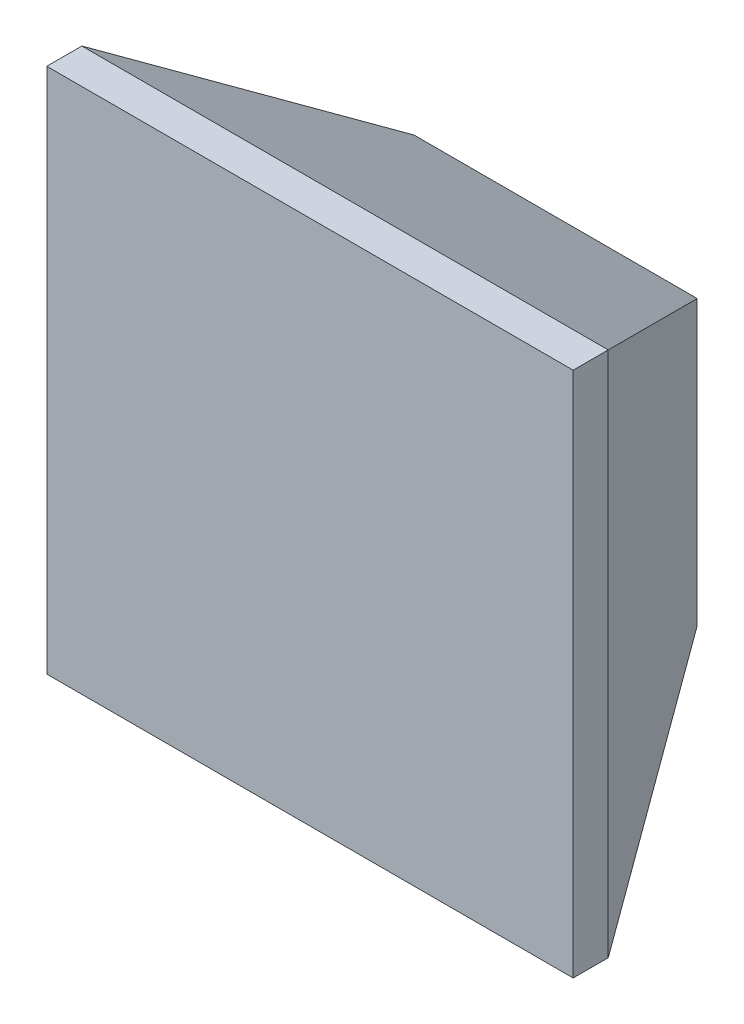
ISO-10303-21;
HEADER;
FILE_DESCRIPTION(('STEP AP214'),'2;1');
FILE_NAME('part.step','',(''),(''),'','','');
FILE_SCHEMA(('AUTOMOTIVE_DESIGN { 1 0 10303 214 1 1 1 1 }'));
ENDSEC;
DATA;
#1=APPLICATION_CONTEXT('core data for automotive mechanical design processes');
#2=APPLICATION_PROTOCOL_DEFINITION('international standard','automotive_design',2000,#1);
#3=PRODUCT_CONTEXT('',#1,'mechanical');
#4=PRODUCT('Part','Part','',(#3));
#5=PRODUCT_RELATED_PRODUCT_CATEGORY('part','',(#4));
#6=PRODUCT_DEFINITION_FORMATION('','',#4);
#7=PRODUCT_DEFINITION_CONTEXT('part definition',#1,'design');
#8=PRODUCT_DEFINITION('design','',#6,#7);
#9=PRODUCT_DEFINITION_SHAPE('','',#8);
#10=(LENGTH_UNIT() NAMED_UNIT(*) SI_UNIT(.MILLI.,.METRE.));
#11=(NAMED_UNIT(*) PLANE_ANGLE_UNIT() SI_UNIT($,.RADIAN.));
#12=(NAMED_UNIT(*) SI_UNIT($,.STERADIAN.) SOLID_ANGLE_UNIT());
#13=UNCERTAINTY_MEASURE_WITH_UNIT(LENGTH_MEASURE(1.E-05),#10,'distance_accuracy_value','');
#14=(GEOMETRIC_REPRESENTATION_CONTEXT(3) GLOBAL_UNCERTAINTY_ASSIGNED_CONTEXT((#13)) GLOBAL_UNIT_ASSIGNED_CONTEXT((#10,
#11,#12)) REPRESENTATION_CONTEXT('',''));
#15=CARTESIAN_POINT('',(0.,0.,0.));
#16=DIRECTION('',(0.,0.,1.));
#17=DIRECTION('',(1.,0.,0.));
#18=AXIS2_PLACEMENT_3D('',#15,#16,#17);
#19=CARTESIAN_POINT('',(-75.,75.,-10.));
#20=DIRECTION('',(-0.866025403784438,0.,-0.500000000000001));
#21=DIRECTION('',(-0.500000000000001,0.,0.866025403784438));
#22=AXIS2_PLACEMENT_3D('',#19,#20,#21);
#23=PLANE('',#22);
#24=DIRECTION('',(0.,-1.,0.));
#25=VECTOR('',#24,1.);
#26=CARTESIAN_POINT('',(-75.,75.,-10.));
#27=LINE('',#26,#25);
#28=CARTESIAN_POINT('',(-75.,75.,-10.));
#29=VERTEX_POINT('',#28);
#30=CARTESIAN_POINT('',(-75.,-75.,-10.));
#31=VERTEX_POINT('',#30);
#32=EDGE_CURVE('E116',#29,#31,#27,.T.);
#33=ORIENTED_EDGE('',*,*,#32,.F.);
#34=DIRECTION('',(-0.447213595499959,0.447213595499959,0.774596669241482));
#35=VECTOR('',#34,1.);
#36=CARTESIAN_POINT('',(-75.,75.,-10.));
#37=LINE('',#36,#35);
#38=CARTESIAN_POINT('',(-40.3589838486223,40.3589838486224,-70.));
#39=VERTEX_POINT('',#38);
#40=EDGE_CURVE('E11',#39,#29,#37,.T.);
#41=ORIENTED_EDGE('',*,*,#40,.F.);
#42=DIRECTION('',(0.,-1.,0.));
#43=VECTOR('',#42,1.);
#44=CARTESIAN_POINT('',(-40.3589838486223,-75.,-70.));
#45=LINE('',#44,#43);
#46=CARTESIAN_POINT('',(-40.3589838486223,-40.3589838486224,-70.));
#47=VERTEX_POINT('',#46);
#48=EDGE_CURVE('E130',#39,#47,#45,.T.);
#49=ORIENTED_EDGE('',*,*,#48,.T.);
#50=DIRECTION('',(-0.447213595499959,-0.447213595499959,0.774596669241482));
#51=VECTOR('',#50,1.);
#52=CARTESIAN_POINT('',(-44.9999999999999,-44.9999999999999,-61.9615242270663));
#53=LINE('',#52,#51);
#54=EDGE_CURVE('E69',#47,#31,#53,.T.);
#55=ORIENTED_EDGE('',*,*,#54,.T.);
#56=EDGE_LOOP('',(#33,#41,#49,#55));
#57=FACE_BOUND('',#56,.T.);
#58=ADVANCED_FACE('F32',(#57),#23,.T.);
#59=CARTESIAN_POINT('',(-75.,75.,-10.));
#60=DIRECTION('',(0.,0.866025403784438,-0.500000000000001));
#61=DIRECTION('',(0.,0.500000000000001,0.866025403784438));
#62=AXIS2_PLACEMENT_3D('',#59,#60,#61);
#63=PLANE('',#62);
#64=DIRECTION('',(-1.,0.,0.));
#65=VECTOR('',#64,1.);
#66=CARTESIAN_POINT('',(-75.,75.,-10.));
#67=LINE('',#66,#65);
#68=CARTESIAN_POINT('',(75.,75.,-10.));
#69=VERTEX_POINT('',#68);
#70=EDGE_CURVE('E128',#69,#29,#67,.T.);
#71=ORIENTED_EDGE('',*,*,#70,.F.);
#72=DIRECTION('',(0.447213595499959,0.447213595499959,0.774596669241482));
#73=VECTOR('',#72,1.);
#74=CARTESIAN_POINT('',(75.,75.,-10.));
#75=LINE('',#74,#73);
#76=CARTESIAN_POINT('',(40.3589838486224,40.3589838486224,-70.));
#77=VERTEX_POINT('',#76);
#78=EDGE_CURVE('E42',#77,#69,#75,.T.);
#79=ORIENTED_EDGE('',*,*,#78,.F.);
#80=DIRECTION('',(-1.,0.,0.));
#81=VECTOR('',#80,1.);
#82=CARTESIAN_POINT('',(-75.,40.3589838486224,-70.));
#83=LINE('',#82,#81);
#84=EDGE_CURVE('E133',#77,#39,#83,.T.);
#85=ORIENTED_EDGE('',*,*,#84,.T.);
#86=ORIENTED_EDGE('',*,*,#40,.T.);
#87=EDGE_LOOP('',(#71,#79,#85,#86));
#88=FACE_BOUND('',#87,.T.);
#89=ADVANCED_FACE('F34',(#88),#63,.T.);
#90=CARTESIAN_POINT('',(75.,75.,-10.));
#91=DIRECTION('',(0.866025403784438,0.,-0.500000000000001));
#92=DIRECTION('',(-0.500000000000001,0.,-0.866025403784438));
#93=AXIS2_PLACEMENT_3D('',#90,#91,#92);
#94=PLANE('',#93);
#95=DIRECTION('',(0.,1.,0.));
#96=VECTOR('',#95,1.);
#97=CARTESIAN_POINT('',(75.,75.,-10.));
#98=LINE('',#97,#96);
#99=CARTESIAN_POINT('',(75.,-75.,-10.));
#100=VERTEX_POINT('',#99);
#101=EDGE_CURVE('E125',#100,#69,#98,.T.);
#102=ORIENTED_EDGE('',*,*,#101,.F.);
#103=DIRECTION('',(0.447213595499959,-0.447213595499959,0.774596669241482));
#104=VECTOR('',#103,1.);
#105=CARTESIAN_POINT('',(44.9999999999999,-44.9999999999999,-61.9615242270663));
#106=LINE('',#105,#104);
#107=CARTESIAN_POINT('',(40.3589838486224,-40.3589838486224,-70.));
#108=VERTEX_POINT('',#107);
#109=EDGE_CURVE('E62',#108,#100,#106,.T.);
#110=ORIENTED_EDGE('',*,*,#109,.F.);
#111=DIRECTION('',(0.,1.,0.));
#112=VECTOR('',#111,1.);
#113=CARTESIAN_POINT('',(40.3589838486224,-75.,-70.));
#114=LINE('',#113,#112);
#115=EDGE_CURVE('E138',#108,#77,#114,.T.);
#116=ORIENTED_EDGE('',*,*,#115,.T.);
#117=ORIENTED_EDGE('',*,*,#78,.T.);
#118=EDGE_LOOP('',(#102,#110,#116,#117));
#119=FACE_BOUND('',#118,.T.);
#120=ADVANCED_FACE('F155',(#119),#94,.T.);
#121=CARTESIAN_POINT('',(-75.,-75.,-10.));
#122=DIRECTION('',(0.,-0.866025403784438,-0.500000000000001));
#123=DIRECTION('',(0.,0.500000000000001,-0.866025403784438));
#124=AXIS2_PLACEMENT_3D('',#121,#122,#123);
#125=PLANE('',#124);
#126=DIRECTION('',(1.,0.,0.));
#127=VECTOR('',#126,1.);
#128=CARTESIAN_POINT('',(-75.,-75.,-10.));
#129=LINE('',#128,#127);
#130=EDGE_CURVE('E118',#31,#100,#129,.T.);
#131=ORIENTED_EDGE('',*,*,#130,.F.);
#132=ORIENTED_EDGE('',*,*,#54,.F.);
#133=DIRECTION('',(1.,0.,0.));
#134=VECTOR('',#133,1.);
#135=CARTESIAN_POINT('',(-75.,-40.3589838486224,-70.));
#136=LINE('',#135,#134);
#137=EDGE_CURVE('E36',#47,#108,#136,.T.);
#138=ORIENTED_EDGE('',*,*,#137,.T.);
#139=ORIENTED_EDGE('',*,*,#109,.T.);
#140=EDGE_LOOP('',(#131,#132,#138,#139));
#141=FACE_BOUND('',#140,.T.);
#142=ADVANCED_FACE('F140',(#141),#125,.T.);
#143=CARTESIAN_POINT('',(-75.,-75.,-70.));
#144=DIRECTION('',(0.,0.,1.));
#145=DIRECTION('',(1.,0.,0.));
#146=AXIS2_PLACEMENT_3D('',#143,#144,#145);
#147=PLANE('',#146);
#148=ORIENTED_EDGE('',*,*,#48,.F.);
#149=ORIENTED_EDGE('',*,*,#84,.F.);
#150=ORIENTED_EDGE('',*,*,#115,.F.);
#151=ORIENTED_EDGE('',*,*,#137,.F.);
#152=EDGE_LOOP('',(#148,#149,#150,#151));
#153=FACE_BOUND('',#152,.T.);
#154=ADVANCED_FACE('F142',(#153),#147,.F.);
#155=CARTESIAN_POINT('',(-75.,75.,0.));
#156=DIRECTION('',(1.,0.,0.));
#157=DIRECTION('',(0.,0.,-1.));
#158=AXIS2_PLACEMENT_3D('',#155,#156,#157);
#159=PLANE('',#158);
#160=ORIENTED_EDGE('',*,*,#32,.T.);
#161=DIRECTION('',(0.,0.,-1.));
#162=VECTOR('',#161,1.);
#163=CARTESIAN_POINT('',(-75.,-75.,0.));
#164=LINE('',#163,#162);
#165=CARTESIAN_POINT('',(-75.,-75.,0.));
#166=VERTEX_POINT('',#165);
#167=EDGE_CURVE('E98',#166,#31,#164,.T.);
#168=ORIENTED_EDGE('',*,*,#167,.F.);
#169=DIRECTION('',(0.,-1.,0.));
#170=VECTOR('',#169,1.);
#171=CARTESIAN_POINT('',(-75.,75.,0.));
#172=LINE('',#171,#170);
#173=CARTESIAN_POINT('',(-75.,75.,0.));
#174=VERTEX_POINT('',#173);
#175=EDGE_CURVE('E105',#174,#166,#172,.T.);
#176=ORIENTED_EDGE('',*,*,#175,.F.);
#177=DIRECTION('',(0.,0.,-1.));
#178=VECTOR('',#177,1.);
#179=CARTESIAN_POINT('',(-75.,75.,0.));
#180=LINE('',#179,#178);
#181=EDGE_CURVE('E148',#174,#29,#180,.T.);
#182=ORIENTED_EDGE('',*,*,#181,.T.);
#183=EDGE_LOOP('',(#160,#168,#176,#182));
#184=FACE_BOUND('',#183,.T.);
#185=ADVANCED_FACE('F115',(#184),#159,.F.);
#186=CARTESIAN_POINT('',(-75.,-75.,0.));
#187=DIRECTION('',(0.,1.,0.));
#188=DIRECTION('',(0.,0.,1.));
#189=AXIS2_PLACEMENT_3D('',#186,#187,#188);
#190=PLANE('',#189);
#191=ORIENTED_EDGE('',*,*,#130,.T.);
#192=DIRECTION('',(0.,0.,-1.));
#193=VECTOR('',#192,1.);
#194=CARTESIAN_POINT('',(75.,-75.,0.));
#195=LINE('',#194,#193);
#196=CARTESIAN_POINT('',(75.,-75.,0.));
#197=VERTEX_POINT('',#196);
#198=EDGE_CURVE('E101',#197,#100,#195,.T.);
#199=ORIENTED_EDGE('',*,*,#198,.F.);
#200=DIRECTION('',(1.,0.,0.));
#201=VECTOR('',#200,1.);
#202=CARTESIAN_POINT('',(-75.,-75.,0.));
#203=LINE('',#202,#201);
#204=EDGE_CURVE('E93',#166,#197,#203,.T.);
#205=ORIENTED_EDGE('',*,*,#204,.F.);
#206=ORIENTED_EDGE('',*,*,#167,.T.);
#207=EDGE_LOOP('',(#191,#199,#205,#206));
#208=FACE_BOUND('',#207,.T.);
#209=ADVANCED_FACE('F96',(#208),#190,.F.);
#210=CARTESIAN_POINT('',(75.,75.,0.));
#211=DIRECTION('',(-1.,0.,0.));
#212=DIRECTION('',(0.,0.,1.));
#213=AXIS2_PLACEMENT_3D('',#210,#211,#212);
#214=PLANE('',#213);
#215=ORIENTED_EDGE('',*,*,#101,.T.);
#216=DIRECTION('',(0.,0.,-1.));
#217=VECTOR('',#216,1.);
#218=CARTESIAN_POINT('',(75.,75.,0.));
#219=LINE('',#218,#217);
#220=CARTESIAN_POINT('',(75.,75.,0.));
#221=VERTEX_POINT('',#220);
#222=EDGE_CURVE('E120',#221,#69,#219,.T.);
#223=ORIENTED_EDGE('',*,*,#222,.F.);
#224=DIRECTION('',(0.,1.,0.));
#225=VECTOR('',#224,1.);
#226=CARTESIAN_POINT('',(75.,75.,0.));
#227=LINE('',#226,#225);
#228=EDGE_CURVE('E104',#197,#221,#227,.T.);
#229=ORIENTED_EDGE('',*,*,#228,.F.);
#230=ORIENTED_EDGE('',*,*,#198,.T.);
#231=EDGE_LOOP('',(#215,#223,#229,#230));
#232=FACE_BOUND('',#231,.T.);
#233=ADVANCED_FACE('F144',(#232),#214,.F.);
#234=CARTESIAN_POINT('',(-75.,75.,0.));
#235=DIRECTION('',(0.,-1.,0.));
#236=DIRECTION('',(0.,0.,-1.));
#237=AXIS2_PLACEMENT_3D('',#234,#235,#236);
#238=PLANE('',#237);
#239=ORIENTED_EDGE('',*,*,#70,.T.);
#240=ORIENTED_EDGE('',*,*,#181,.F.);
#241=DIRECTION('',(-1.,0.,0.));
#242=VECTOR('',#241,1.);
#243=CARTESIAN_POINT('',(-75.,75.,0.));
#244=LINE('',#243,#242);
#245=EDGE_CURVE('E110',#221,#174,#244,.T.);
#246=ORIENTED_EDGE('',*,*,#245,.F.);
#247=ORIENTED_EDGE('',*,*,#222,.T.);
#248=EDGE_LOOP('',(#239,#240,#246,#247));
#249=FACE_BOUND('',#248,.T.);
#250=ADVANCED_FACE('F152',(#249),#238,.F.);
#251=CARTESIAN_POINT('',(-75.,-75.,0.));
#252=DIRECTION('',(0.,0.,1.));
#253=DIRECTION('',(1.,0.,0.));
#254=AXIS2_PLACEMENT_3D('',#251,#252,#253);
#255=PLANE('',#254);
#256=ORIENTED_EDGE('',*,*,#175,.T.);
#257=ORIENTED_EDGE('',*,*,#204,.T.);
#258=ORIENTED_EDGE('',*,*,#228,.T.);
#259=ORIENTED_EDGE('',*,*,#245,.T.);
#260=EDGE_LOOP('',(#256,#257,#258,#259));
#261=FACE_BOUND('',#260,.T.);
#262=ADVANCED_FACE('F108',(#261),#255,.T.);
#263=CLOSED_SHELL('',(#58,#89,#120,#142,#154,#185,#209,#233,#250,#262));
#264=MANIFOLD_SOLID_BREP('B2',#263);
#265=ADVANCED_BREP_SHAPE_REPRESENTATION('',(#18,#264),#14);
#266=SHAPE_DEFINITION_REPRESENTATION(#9,#265);
ENDSEC;
END-ISO-10303-21;
